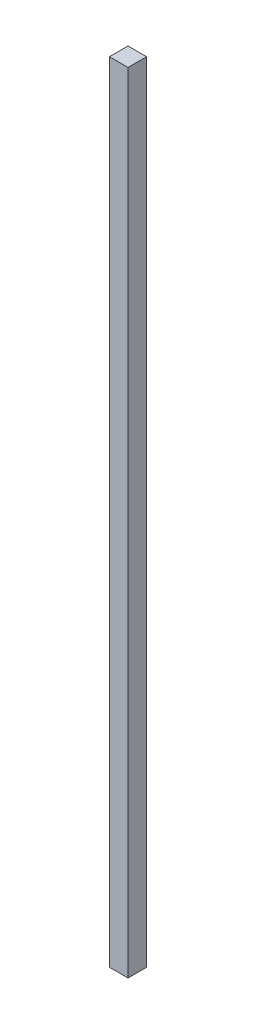
ISO-10303-21;
HEADER;
FILE_DESCRIPTION(('STEP AP214'),'2;1');
FILE_NAME('part.step','',(''),(''),'','','');
FILE_SCHEMA(('AUTOMOTIVE_DESIGN { 1 0 10303 214 1 1 1 1 }'));
ENDSEC;
DATA;
#1=APPLICATION_CONTEXT('core data for automotive mechanical design processes');
#2=APPLICATION_PROTOCOL_DEFINITION('international standard','automotive_design',2000,#1);
#3=PRODUCT_CONTEXT('',#1,'mechanical');
#4=PRODUCT('Part','Part','',(#3));
#5=PRODUCT_RELATED_PRODUCT_CATEGORY('part','',(#4));
#6=PRODUCT_DEFINITION_FORMATION('','',#4);
#7=PRODUCT_DEFINITION_CONTEXT('part definition',#1,'design');
#8=PRODUCT_DEFINITION('design','',#6,#7);
#9=PRODUCT_DEFINITION_SHAPE('','',#8);
#10=(LENGTH_UNIT() NAMED_UNIT(*) SI_UNIT(.MILLI.,.METRE.));
#11=(NAMED_UNIT(*) PLANE_ANGLE_UNIT() SI_UNIT($,.RADIAN.));
#12=(NAMED_UNIT(*) SI_UNIT($,.STERADIAN.) SOLID_ANGLE_UNIT());
#13=UNCERTAINTY_MEASURE_WITH_UNIT(LENGTH_MEASURE(1.E-05),#10,'distance_accuracy_value','');
#14=(GEOMETRIC_REPRESENTATION_CONTEXT(3) GLOBAL_UNCERTAINTY_ASSIGNED_CONTEXT((#13)) GLOBAL_UNIT_ASSIGNED_CONTEXT((#10,
#11,#12)) REPRESENTATION_CONTEXT('',''));
#15=CARTESIAN_POINT('',(0.,0.,0.));
#16=DIRECTION('',(0.,0.,1.));
#17=DIRECTION('',(1.,0.,0.));
#18=AXIS2_PLACEMENT_3D('',#15,#16,#17);
#19=CARTESIAN_POINT('',(126.,640.,-604.));
#20=DIRECTION('',(-1.,0.,0.));
#21=DIRECTION('',(0.,0.,1.));
#22=AXIS2_PLACEMENT_3D('',#19,#20,#21);
#23=PLANE('',#22);
#24=DIRECTION('',(0.,-1.,0.));
#25=VECTOR('',#24,1.);
#26=CARTESIAN_POINT('',(126.,640.,-596.));
#27=LINE('',#26,#25);
#28=CARTESIAN_POINT('',(126.,980.,-596.));
#29=VERTEX_POINT('',#28);
#30=CARTESIAN_POINT('',(126.,640.,-596.));
#31=VERTEX_POINT('',#30);
#32=EDGE_CURVE('E103',#29,#31,#27,.T.);
#33=ORIENTED_EDGE('',*,*,#32,.F.);
#34=DIRECTION('',(0.,0.,1.));
#35=VECTOR('',#34,1.);
#36=CARTESIAN_POINT('',(126.,980.,-604.));
#37=LINE('',#36,#35);
#38=CARTESIAN_POINT('',(126.,980.,-604.));
#39=VERTEX_POINT('',#38);
#40=EDGE_CURVE('E11',#39,#29,#37,.T.);
#41=ORIENTED_EDGE('',*,*,#40,.F.);
#42=DIRECTION('',(0.,-1.,0.));
#43=VECTOR('',#42,1.);
#44=CARTESIAN_POINT('',(126.,640.,-604.));
#45=LINE('',#44,#43);
#46=CARTESIAN_POINT('',(126.,640.,-604.));
#47=VERTEX_POINT('',#46);
#48=EDGE_CURVE('E97',#39,#47,#45,.T.);
#49=ORIENTED_EDGE('',*,*,#48,.T.);
#50=DIRECTION('',(0.,0.,1.));
#51=VECTOR('',#50,1.);
#52=CARTESIAN_POINT('',(126.,640.,-604.));
#53=LINE('',#52,#51);
#54=EDGE_CURVE('E42',#47,#31,#53,.T.);
#55=ORIENTED_EDGE('',*,*,#54,.T.);
#56=EDGE_LOOP('',(#33,#41,#49,#55));
#57=FACE_BOUND('',#56,.T.);
#58=ADVANCED_FACE('F39',(#57),#23,.T.);
#59=CARTESIAN_POINT('',(126.,980.,-604.));
#60=DIRECTION('',(0.,1.,0.));
#61=DIRECTION('',(0.,0.,1.));
#62=AXIS2_PLACEMENT_3D('',#59,#60,#61);
#63=PLANE('',#62);
#64=DIRECTION('',(-1.,0.,0.));
#65=VECTOR('',#64,1.);
#66=CARTESIAN_POINT('',(126.,980.,-596.));
#67=LINE('',#66,#65);
#68=CARTESIAN_POINT('',(134.,980.,-596.));
#69=VERTEX_POINT('',#68);
#70=EDGE_CURVE('E99',#69,#29,#67,.T.);
#71=ORIENTED_EDGE('',*,*,#70,.F.);
#72=DIRECTION('',(0.,0.,1.));
#73=VECTOR('',#72,1.);
#74=CARTESIAN_POINT('',(134.,980.,-604.));
#75=LINE('',#74,#73);
#76=CARTESIAN_POINT('',(134.,980.,-604.));
#77=VERTEX_POINT('',#76);
#78=EDGE_CURVE('E48',#77,#69,#75,.T.);
#79=ORIENTED_EDGE('',*,*,#78,.F.);
#80=DIRECTION('',(-1.,0.,0.));
#81=VECTOR('',#80,1.);
#82=CARTESIAN_POINT('',(126.,980.,-604.));
#83=LINE('',#82,#81);
#84=EDGE_CURVE('E94',#77,#39,#83,.T.);
#85=ORIENTED_EDGE('',*,*,#84,.T.);
#86=ORIENTED_EDGE('',*,*,#40,.T.);
#87=EDGE_LOOP('',(#71,#79,#85,#86));
#88=FACE_BOUND('',#87,.T.);
#89=ADVANCED_FACE('F113',(#88),#63,.T.);
#90=CARTESIAN_POINT('',(134.,640.,-604.));
#91=DIRECTION('',(1.,0.,0.));
#92=DIRECTION('',(0.,0.,-1.));
#93=AXIS2_PLACEMENT_3D('',#90,#91,#92);
#94=PLANE('',#93);
#95=DIRECTION('',(0.,1.,0.));
#96=VECTOR('',#95,1.);
#97=CARTESIAN_POINT('',(134.,640.,-596.));
#98=LINE('',#97,#96);
#99=CARTESIAN_POINT('',(134.,640.,-596.));
#100=VERTEX_POINT('',#99);
#101=EDGE_CURVE('E89',#100,#69,#98,.T.);
#102=ORIENTED_EDGE('',*,*,#101,.F.);
#103=DIRECTION('',(0.,0.,1.));
#104=VECTOR('',#103,1.);
#105=CARTESIAN_POINT('',(134.,640.,-604.));
#106=LINE('',#105,#104);
#107=CARTESIAN_POINT('',(134.,640.,-604.));
#108=VERTEX_POINT('',#107);
#109=EDGE_CURVE('E84',#108,#100,#106,.T.);
#110=ORIENTED_EDGE('',*,*,#109,.F.);
#111=DIRECTION('',(0.,1.,0.));
#112=VECTOR('',#111,1.);
#113=CARTESIAN_POINT('',(134.,640.,-604.));
#114=LINE('',#113,#112);
#115=EDGE_CURVE('E87',#108,#77,#114,.T.);
#116=ORIENTED_EDGE('',*,*,#115,.T.);
#117=ORIENTED_EDGE('',*,*,#78,.T.);
#118=EDGE_LOOP('',(#102,#110,#116,#117));
#119=FACE_BOUND('',#118,.T.);
#120=ADVANCED_FACE('F86',(#119),#94,.T.);
#121=CARTESIAN_POINT('',(126.,640.,-604.));
#122=DIRECTION('',(0.,-1.,0.));
#123=DIRECTION('',(0.,0.,-1.));
#124=AXIS2_PLACEMENT_3D('',#121,#122,#123);
#125=PLANE('',#124);
#126=DIRECTION('',(1.,0.,0.));
#127=VECTOR('',#126,1.);
#128=CARTESIAN_POINT('',(126.,640.,-596.));
#129=LINE('',#128,#127);
#130=EDGE_CURVE('E106',#31,#100,#129,.T.);
#131=ORIENTED_EDGE('',*,*,#130,.F.);
#132=ORIENTED_EDGE('',*,*,#54,.F.);
#133=DIRECTION('',(1.,0.,0.));
#134=VECTOR('',#133,1.);
#135=CARTESIAN_POINT('',(126.,640.,-604.));
#136=LINE('',#135,#134);
#137=EDGE_CURVE('E93',#47,#108,#136,.T.);
#138=ORIENTED_EDGE('',*,*,#137,.T.);
#139=ORIENTED_EDGE('',*,*,#109,.T.);
#140=EDGE_LOOP('',(#131,#132,#138,#139));
#141=FACE_BOUND('',#140,.T.);
#142=ADVANCED_FACE('F96',(#141),#125,.T.);
#143=CARTESIAN_POINT('',(0.,0.,-604.));
#144=DIRECTION('',(0.,0.,-1.));
#145=DIRECTION('',(-1.,0.,0.));
#146=AXIS2_PLACEMENT_3D('',#143,#144,#145);
#147=PLANE('',#146);
#148=ORIENTED_EDGE('',*,*,#48,.F.);
#149=ORIENTED_EDGE('',*,*,#84,.F.);
#150=ORIENTED_EDGE('',*,*,#115,.F.);
#151=ORIENTED_EDGE('',*,*,#137,.F.);
#152=EDGE_LOOP('',(#148,#149,#150,#151));
#153=FACE_BOUND('',#152,.T.);
#154=ADVANCED_FACE('F92',(#153),#147,.T.);
#155=CARTESIAN_POINT('',(0.,0.,-596.));
#156=DIRECTION('',(0.,0.,-1.));
#157=DIRECTION('',(-1.,0.,0.));
#158=AXIS2_PLACEMENT_3D('',#155,#156,#157);
#159=PLANE('',#158);
#160=ORIENTED_EDGE('',*,*,#32,.T.);
#161=ORIENTED_EDGE('',*,*,#130,.T.);
#162=ORIENTED_EDGE('',*,*,#101,.T.);
#163=ORIENTED_EDGE('',*,*,#70,.T.);
#164=EDGE_LOOP('',(#160,#161,#162,#163));
#165=FACE_BOUND('',#164,.T.);
#166=ADVANCED_FACE('F112',(#165),#159,.F.);
#167=CLOSED_SHELL('',(#58,#89,#120,#142,#154,#166));
#168=MANIFOLD_SOLID_BREP('B2',#167);
#169=ADVANCED_BREP_SHAPE_REPRESENTATION('',(#18,#168),#14);
#170=SHAPE_DEFINITION_REPRESENTATION(#9,#169);
ENDSEC;
END-ISO-10303-21;
